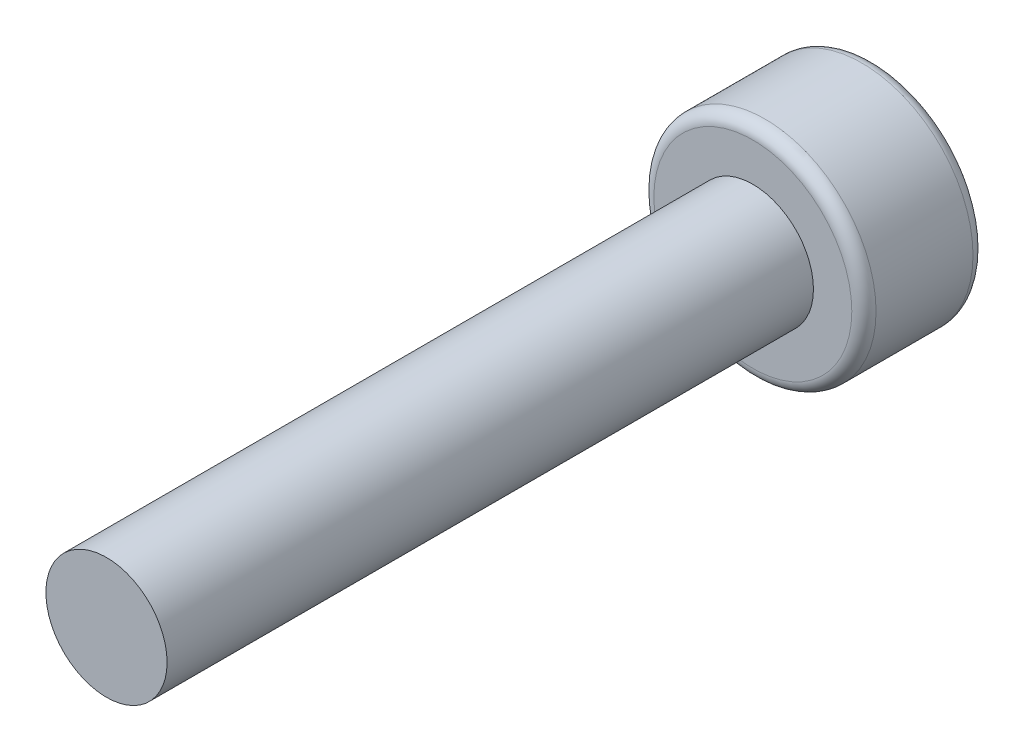
ISO-10303-21;
HEADER;
FILE_DESCRIPTION(('STEP AP214'),'2;1');
FILE_NAME('part.step','',(''),(''),'','','');
FILE_SCHEMA(('AUTOMOTIVE_DESIGN { 1 0 10303 214 1 1 1 1 }'));
ENDSEC;
DATA;
#1=APPLICATION_CONTEXT('core data for automotive mechanical design processes');
#2=APPLICATION_PROTOCOL_DEFINITION('international standard','automotive_design',2000,#1);
#3=PRODUCT_CONTEXT('',#1,'mechanical');
#4=PRODUCT('Part','Part','',(#3));
#5=PRODUCT_RELATED_PRODUCT_CATEGORY('part','',(#4));
#6=PRODUCT_DEFINITION_FORMATION('','',#4);
#7=PRODUCT_DEFINITION_CONTEXT('part definition',#1,'design');
#8=PRODUCT_DEFINITION('design','',#6,#7);
#9=PRODUCT_DEFINITION_SHAPE('','',#8);
#10=(LENGTH_UNIT() NAMED_UNIT(*) SI_UNIT(.MILLI.,.METRE.));
#11=(NAMED_UNIT(*) PLANE_ANGLE_UNIT() SI_UNIT($,.RADIAN.));
#12=(NAMED_UNIT(*) SI_UNIT($,.STERADIAN.) SOLID_ANGLE_UNIT());
#13=UNCERTAINTY_MEASURE_WITH_UNIT(LENGTH_MEASURE(1.E-05),#10,'distance_accuracy_value','');
#14=(GEOMETRIC_REPRESENTATION_CONTEXT(3) GLOBAL_UNCERTAINTY_ASSIGNED_CONTEXT((#13)) GLOBAL_UNIT_ASSIGNED_CONTEXT((#10,
#11,#12)) REPRESENTATION_CONTEXT('',''));
#15=CARTESIAN_POINT('',(0.,0.,0.));
#16=DIRECTION('',(0.,0.,1.));
#17=DIRECTION('',(1.,0.,0.));
#18=AXIS2_PLACEMENT_3D('',#15,#16,#17);
#19=CARTESIAN_POINT('',(0.,0.,3.));
#20=DIRECTION('',(0.,0.,-1.));
#21=DIRECTION('',(-1.,0.,0.));
#22=AXIS2_PLACEMENT_3D('',#19,#20,#21);
#23=CYLINDRICAL_SURFACE('',#22,2.75);
#24=CARTESIAN_POINT('',(0.,0.,0.3));
#25=DIRECTION('',(0.,0.,1.));
#26=DIRECTION('',(1.,0.,0.));
#27=AXIS2_PLACEMENT_3D('',#24,#25,#26);
#28=CIRCLE('',#27,2.75);
#29=CARTESIAN_POINT('',(2.75,0.,0.3));
#30=VERTEX_POINT('',#29);
#31=EDGE_CURVE('E155',#30,#30,#28,.T.);
#32=ORIENTED_EDGE('',*,*,#31,.T.);
#33=EDGE_LOOP('',(#32));
#34=FACE_BOUND('',#33,.T.);
#35=CARTESIAN_POINT('',(0.,0.,2.7));
#36=DIRECTION('',(0.,0.,1.));
#37=DIRECTION('',(1.,0.,0.));
#38=AXIS2_PLACEMENT_3D('',#35,#36,#37);
#39=CIRCLE('',#38,2.75);
#40=CARTESIAN_POINT('',(2.75,0.,2.7));
#41=VERTEX_POINT('',#40);
#42=EDGE_CURVE('E152',#41,#41,#39,.F.);
#43=ORIENTED_EDGE('',*,*,#42,.T.);
#44=EDGE_LOOP('',(#43));
#45=FACE_BOUND('',#44,.T.);
#46=ADVANCED_FACE('F39',(#34,#45),#23,.T.);
#47=CARTESIAN_POINT('',(0.,0.,3.));
#48=DIRECTION('',(0.,0.,1.));
#49=DIRECTION('',(1.,0.,0.));
#50=AXIS2_PLACEMENT_3D('',#47,#48,#49);
#51=PLANE('',#50);
#52=CARTESIAN_POINT('',(0.,0.,3.));
#53=DIRECTION('',(0.,0.,1.));
#54=DIRECTION('',(1.,0.,0.));
#55=AXIS2_PLACEMENT_3D('',#52,#53,#54);
#56=CIRCLE('',#55,2.45);
#57=CARTESIAN_POINT('',(2.45,0.,3.));
#58=VERTEX_POINT('',#57);
#59=EDGE_CURVE('E11',#58,#58,#56,.T.);
#60=ORIENTED_EDGE('',*,*,#59,.T.);
#61=EDGE_LOOP('',(#60));
#62=FACE_BOUND('',#61,.T.);
#63=CARTESIAN_POINT('',(0.,0.,3.));
#64=DIRECTION('',(0.,0.,1.));
#65=DIRECTION('',(1.,0.,0.));
#66=AXIS2_PLACEMENT_3D('',#63,#64,#65);
#67=CIRCLE('',#66,1.5);
#68=CARTESIAN_POINT('',(1.5,0.,3.));
#69=VERTEX_POINT('',#68);
#70=EDGE_CURVE('E149',#69,#69,#67,.T.);
#71=ORIENTED_EDGE('',*,*,#70,.F.);
#72=EDGE_LOOP('',(#71));
#73=FACE_BOUND('',#72,.T.);
#74=ADVANCED_FACE('F170',(#62,#73),#51,.T.);
#75=CARTESIAN_POINT('',(0.,0.,0.));
#76=DIRECTION('',(0.,0.,1.));
#77=DIRECTION('',(1.,0.,0.));
#78=AXIS2_PLACEMENT_3D('',#75,#76,#77);
#79=PLANE('',#78);
#80=DIRECTION('',(0.590811113127551,-0.806809908593706,0.));
#81=VECTOR('',#80,1.);
#82=CARTESIAN_POINT('',(0.820853493075304,1.8624081611757,0.));
#83=LINE('',#82,#81);
#84=CARTESIAN_POINT('',(0.820853493075304,1.8624081611757,0.));
#85=VERTEX_POINT('',#84);
#86=CARTESIAN_POINT('',(2.02331952633127,0.220324102799441,0.));
#87=VERTEX_POINT('',#86);
#88=EDGE_CURVE('E128',#85,#87,#83,.T.);
#89=ORIENTED_EDGE('',*,*,#88,.F.);
#90=DIRECTION('',(0.994123433430926,0.108252478509768,0.));
#91=VECTOR('',#90,1.);
#92=CARTESIAN_POINT('',(-1.20246603325596,1.64208405837626,0.));
#93=LINE('',#92,#91);
#94=CARTESIAN_POINT('',(-1.20246603325596,1.64208405837626,0.));
#95=VERTEX_POINT('',#94);
#96=EDGE_CURVE('E54',#95,#85,#93,.T.);
#97=ORIENTED_EDGE('',*,*,#96,.F.);
#98=DIRECTION('',(0.403312320303375,0.915062387103474,0.));
#99=VECTOR('',#98,1.);
#100=CARTESIAN_POINT('',(-2.02331952633127,-0.220324102799442,0.));
#101=LINE('',#100,#99);
#102=CARTESIAN_POINT('',(-2.02331952633127,-0.220324102799442,0.));
#103=VERTEX_POINT('',#102);
#104=EDGE_CURVE('E137',#103,#95,#101,.T.);
#105=ORIENTED_EDGE('',*,*,#104,.F.);
#106=DIRECTION('',(-0.590811113127551,0.806809908593706,0.));
#107=VECTOR('',#106,1.);
#108=CARTESIAN_POINT('',(-0.820853493075303,-1.8624081611757,0.));
#109=LINE('',#108,#107);
#110=CARTESIAN_POINT('',(-0.820853493075303,-1.8624081611757,0.));
#111=VERTEX_POINT('',#110);
#112=EDGE_CURVE('E135',#111,#103,#109,.T.);
#113=ORIENTED_EDGE('',*,*,#112,.F.);
#114=DIRECTION('',(-0.994123433430926,-0.108252478509768,0.));
#115=VECTOR('',#114,1.);
#116=CARTESIAN_POINT('',(1.20246603325596,-1.64208405837625,0.));
#117=LINE('',#116,#115);
#118=CARTESIAN_POINT('',(1.20246603325596,-1.64208405837625,0.));
#119=VERTEX_POINT('',#118);
#120=EDGE_CURVE('E102',#119,#111,#117,.T.);
#121=ORIENTED_EDGE('',*,*,#120,.F.);
#122=DIRECTION('',(-0.403312320303375,-0.915062387103474,0.));
#123=VECTOR('',#122,1.);
#124=CARTESIAN_POINT('',(2.02331952633127,0.220324102799441,0.));
#125=LINE('',#124,#123);
#126=EDGE_CURVE('E131',#87,#119,#125,.T.);
#127=ORIENTED_EDGE('',*,*,#126,.F.);
#128=EDGE_LOOP('',(#89,#97,#105,#113,#121,#127));
#129=FACE_BOUND('',#128,.T.);
#130=CARTESIAN_POINT('',(0.,0.,0.));
#131=DIRECTION('',(0.,0.,1.));
#132=DIRECTION('',(1.,0.,0.));
#133=AXIS2_PLACEMENT_3D('',#130,#131,#132);
#134=CIRCLE('',#133,2.45);
#135=CARTESIAN_POINT('',(2.45,0.,0.));
#136=VERTEX_POINT('',#135);
#137=EDGE_CURVE('E47',#136,#136,#134,.F.);
#138=ORIENTED_EDGE('',*,*,#137,.T.);
#139=EDGE_LOOP('',(#138));
#140=FACE_BOUND('',#139,.T.);
#141=ADVANCED_FACE('F160',(#129,#140),#79,.F.);
#142=CARTESIAN_POINT('',(0.,0.,19.));
#143=DIRECTION('',(0.,0.,-1.));
#144=DIRECTION('',(-1.,0.,0.));
#145=AXIS2_PLACEMENT_3D('',#142,#143,#144);
#146=CYLINDRICAL_SURFACE('',#145,1.5);
#147=CARTESIAN_POINT('',(0.,0.,19.));
#148=DIRECTION('',(0.,0.,1.));
#149=DIRECTION('',(1.,0.,0.));
#150=AXIS2_PLACEMENT_3D('',#147,#148,#149);
#151=CIRCLE('',#150,1.5);
#152=CARTESIAN_POINT('',(1.5,0.,19.));
#153=VERTEX_POINT('',#152);
#154=EDGE_CURVE('E141',#153,#153,#151,.T.);
#155=ORIENTED_EDGE('',*,*,#154,.F.);
#156=EDGE_LOOP('',(#155));
#157=FACE_BOUND('',#156,.T.);
#158=ORIENTED_EDGE('',*,*,#70,.T.);
#159=EDGE_LOOP('',(#158));
#160=FACE_BOUND('',#159,.T.);
#161=ADVANCED_FACE('F184',(#157,#160),#146,.T.);
#162=CARTESIAN_POINT('',(0.,0.,19.));
#163=DIRECTION('',(0.,0.,1.));
#164=DIRECTION('',(1.,0.,0.));
#165=AXIS2_PLACEMENT_3D('',#162,#163,#164);
#166=PLANE('',#165);
#167=ORIENTED_EDGE('',*,*,#154,.T.);
#168=EDGE_LOOP('',(#167));
#169=FACE_BOUND('',#168,.T.);
#170=ADVANCED_FACE('F165',(#169),#166,.T.);
#171=CARTESIAN_POINT('',(0.,0.,0.3));
#172=DIRECTION('',(0.,0.,1.));
#173=DIRECTION('',(1.,0.,0.));
#174=AXIS2_PLACEMENT_3D('',#171,#172,#173);
#175=TOROIDAL_SURFACE('',#174,2.45,0.3);
#176=ORIENTED_EDGE('',*,*,#137,.F.);
#177=EDGE_LOOP('',(#176));
#178=FACE_BOUND('',#177,.T.);
#179=ORIENTED_EDGE('',*,*,#31,.F.);
#180=EDGE_LOOP('',(#179));
#181=FACE_BOUND('',#180,.T.);
#182=ADVANCED_FACE('F162',(#178,#181),#175,.T.);
#183=CARTESIAN_POINT('',(0.,0.,2.7));
#184=DIRECTION('',(0.,0.,1.));
#185=DIRECTION('',(1.,0.,0.));
#186=AXIS2_PLACEMENT_3D('',#183,#184,#185);
#187=TOROIDAL_SURFACE('',#186,2.45,0.3);
#188=ORIENTED_EDGE('',*,*,#42,.F.);
#189=EDGE_LOOP('',(#188));
#190=FACE_BOUND('',#189,.T.);
#191=ORIENTED_EDGE('',*,*,#59,.F.);
#192=EDGE_LOOP('',(#191));
#193=FACE_BOUND('',#192,.T.);
#194=ADVANCED_FACE('F41',(#190,#193),#187,.T.);
#195=CARTESIAN_POINT('',(-1.20246603325596,1.64208405837626,2.));
#196=DIRECTION('',(-0.108252478509768,0.994123433430926,0.));
#197=DIRECTION('',(-0.994123433430926,-0.108252478509768,0.));
#198=AXIS2_PLACEMENT_3D('',#195,#196,#197);
#199=PLANE('',#198);
#200=ORIENTED_EDGE('',*,*,#96,.T.);
#201=DIRECTION('',(0.,0.,-1.));
#202=VECTOR('',#201,1.);
#203=CARTESIAN_POINT('',(0.820853493075304,1.8624081611757,2.));
#204=LINE('',#203,#202);
#205=CARTESIAN_POINT('',(0.820853493075304,1.8624081611757,2.));
#206=VERTEX_POINT('',#205);
#207=EDGE_CURVE('E84',#206,#85,#204,.T.);
#208=ORIENTED_EDGE('',*,*,#207,.F.);
#209=DIRECTION('',(0.994123433430926,0.108252478509768,0.));
#210=VECTOR('',#209,1.);
#211=CARTESIAN_POINT('',(-1.20246603325596,1.64208405837626,2.));
#212=LINE('',#211,#210);
#213=CARTESIAN_POINT('',(-1.20246603325596,1.64208405837626,2.));
#214=VERTEX_POINT('',#213);
#215=EDGE_CURVE('E139',#214,#206,#212,.T.);
#216=ORIENTED_EDGE('',*,*,#215,.F.);
#217=DIRECTION('',(0.,0.,-1.));
#218=VECTOR('',#217,1.);
#219=CARTESIAN_POINT('',(-1.20246603325596,1.64208405837626,2.));
#220=LINE('',#219,#218);
#221=EDGE_CURVE('E62',#214,#95,#220,.T.);
#222=ORIENTED_EDGE('',*,*,#221,.T.);
#223=EDGE_LOOP('',(#200,#208,#216,#222));
#224=FACE_BOUND('',#223,.T.);
#225=ADVANCED_FACE('F176',(#224),#199,.F.);
#226=CARTESIAN_POINT('',(-2.02331952633127,-0.220324102799442,2.));
#227=DIRECTION('',(-0.915062387103474,0.403312320303375,0.));
#228=DIRECTION('',(-0.403312320303375,-0.915062387103474,0.));
#229=AXIS2_PLACEMENT_3D('',#226,#227,#228);
#230=PLANE('',#229);
#231=ORIENTED_EDGE('',*,*,#104,.T.);
#232=ORIENTED_EDGE('',*,*,#221,.F.);
#233=DIRECTION('',(0.403312320303375,0.915062387103474,0.));
#234=VECTOR('',#233,1.);
#235=CARTESIAN_POINT('',(-2.02331952633127,-0.220324102799442,2.));
#236=LINE('',#235,#234);
#237=CARTESIAN_POINT('',(-2.02331952633127,-0.220324102799442,2.));
#238=VERTEX_POINT('',#237);
#239=EDGE_CURVE('E114',#238,#214,#236,.T.);
#240=ORIENTED_EDGE('',*,*,#239,.F.);
#241=DIRECTION('',(0.,0.,-1.));
#242=VECTOR('',#241,1.);
#243=CARTESIAN_POINT('',(-2.02331952633127,-0.220324102799442,2.));
#244=LINE('',#243,#242);
#245=EDGE_CURVE('E106',#238,#103,#244,.T.);
#246=ORIENTED_EDGE('',*,*,#245,.T.);
#247=EDGE_LOOP('',(#231,#232,#240,#246));
#248=FACE_BOUND('',#247,.T.);
#249=ADVANCED_FACE('F200',(#248),#230,.F.);
#250=CARTESIAN_POINT('',(-0.820853493075303,-1.8624081611757,2.));
#251=DIRECTION('',(-0.806809908593706,-0.590811113127551,0.));
#252=DIRECTION('',(0.590811113127551,-0.806809908593706,0.));
#253=AXIS2_PLACEMENT_3D('',#250,#251,#252);
#254=PLANE('',#253);
#255=ORIENTED_EDGE('',*,*,#112,.T.);
#256=ORIENTED_EDGE('',*,*,#245,.F.);
#257=DIRECTION('',(-0.590811113127551,0.806809908593706,0.));
#258=VECTOR('',#257,1.);
#259=CARTESIAN_POINT('',(-0.820853493075303,-1.8624081611757,2.));
#260=LINE('',#259,#258);
#261=CARTESIAN_POINT('',(-0.820853493075303,-1.8624081611757,2.));
#262=VERTEX_POINT('',#261);
#263=EDGE_CURVE('E110',#262,#238,#260,.T.);
#264=ORIENTED_EDGE('',*,*,#263,.F.);
#265=DIRECTION('',(0.,0.,-1.));
#266=VECTOR('',#265,1.);
#267=CARTESIAN_POINT('',(-0.820853493075303,-1.8624081611757,2.));
#268=LINE('',#267,#266);
#269=EDGE_CURVE('E95',#262,#111,#268,.T.);
#270=ORIENTED_EDGE('',*,*,#269,.T.);
#271=EDGE_LOOP('',(#255,#256,#264,#270));
#272=FACE_BOUND('',#271,.T.);
#273=ADVANCED_FACE('F111',(#272),#254,.F.);
#274=CARTESIAN_POINT('',(1.20246603325596,-1.64208405837625,2.));
#275=DIRECTION('',(0.108252478509768,-0.994123433430926,0.));
#276=DIRECTION('',(0.994123433430926,0.108252478509768,0.));
#277=AXIS2_PLACEMENT_3D('',#274,#275,#276);
#278=PLANE('',#277);
#279=ORIENTED_EDGE('',*,*,#120,.T.);
#280=ORIENTED_EDGE('',*,*,#269,.F.);
#281=DIRECTION('',(-0.994123433430926,-0.108252478509768,0.));
#282=VECTOR('',#281,1.);
#283=CARTESIAN_POINT('',(1.20246603325596,-1.64208405837625,2.));
#284=LINE('',#283,#282);
#285=CARTESIAN_POINT('',(1.20246603325596,-1.64208405837625,2.));
#286=VERTEX_POINT('',#285);
#287=EDGE_CURVE('E99',#286,#262,#284,.T.);
#288=ORIENTED_EDGE('',*,*,#287,.F.);
#289=DIRECTION('',(0.,0.,-1.));
#290=VECTOR('',#289,1.);
#291=CARTESIAN_POINT('',(1.20246603325596,-1.64208405837625,2.));
#292=LINE('',#291,#290);
#293=EDGE_CURVE('E107',#286,#119,#292,.T.);
#294=ORIENTED_EDGE('',*,*,#293,.T.);
#295=EDGE_LOOP('',(#279,#280,#288,#294));
#296=FACE_BOUND('',#295,.T.);
#297=ADVANCED_FACE('F97',(#296),#278,.F.);
#298=CARTESIAN_POINT('',(2.02331952633127,0.220324102799441,2.));
#299=DIRECTION('',(0.915062387103474,-0.403312320303375,0.));
#300=DIRECTION('',(0.403312320303375,0.915062387103474,0.));
#301=AXIS2_PLACEMENT_3D('',#298,#299,#300);
#302=PLANE('',#301);
#303=ORIENTED_EDGE('',*,*,#126,.T.);
#304=ORIENTED_EDGE('',*,*,#293,.F.);
#305=DIRECTION('',(-0.403312320303375,-0.915062387103474,0.));
#306=VECTOR('',#305,1.);
#307=CARTESIAN_POINT('',(2.02331952633127,0.220324102799441,2.));
#308=LINE('',#307,#306);
#309=CARTESIAN_POINT('',(2.02331952633127,0.220324102799441,2.));
#310=VERTEX_POINT('',#309);
#311=EDGE_CURVE('E120',#310,#286,#308,.T.);
#312=ORIENTED_EDGE('',*,*,#311,.F.);
#313=DIRECTION('',(0.,0.,-1.));
#314=VECTOR('',#313,1.);
#315=CARTESIAN_POINT('',(2.02331952633127,0.220324102799441,2.));
#316=LINE('',#315,#314);
#317=EDGE_CURVE('E144',#310,#87,#316,.T.);
#318=ORIENTED_EDGE('',*,*,#317,.T.);
#319=EDGE_LOOP('',(#303,#304,#312,#318));
#320=FACE_BOUND('',#319,.T.);
#321=ADVANCED_FACE('F204',(#320),#302,.F.);
#322=CARTESIAN_POINT('',(0.820853493075304,1.8624081611757,2.));
#323=DIRECTION('',(0.806809908593706,0.590811113127551,0.));
#324=DIRECTION('',(-0.590811113127551,0.806809908593706,0.));
#325=AXIS2_PLACEMENT_3D('',#322,#323,#324);
#326=PLANE('',#325);
#327=ORIENTED_EDGE('',*,*,#88,.T.);
#328=ORIENTED_EDGE('',*,*,#317,.F.);
#329=DIRECTION('',(0.590811113127551,-0.806809908593706,0.));
#330=VECTOR('',#329,1.);
#331=CARTESIAN_POINT('',(0.820853493075304,1.8624081611757,2.));
#332=LINE('',#331,#330);
#333=EDGE_CURVE('E122',#206,#310,#332,.T.);
#334=ORIENTED_EDGE('',*,*,#333,.F.);
#335=ORIENTED_EDGE('',*,*,#207,.T.);
#336=EDGE_LOOP('',(#327,#328,#334,#335));
#337=FACE_BOUND('',#336,.T.);
#338=ADVANCED_FACE('F201',(#337),#326,.F.);
#339=CARTESIAN_POINT('',(0.,0.,2.));
#340=DIRECTION('',(0.,0.,-1.));
#341=DIRECTION('',(-1.,0.,0.));
#342=AXIS2_PLACEMENT_3D('',#339,#340,#341);
#343=PLANE('',#342);
#344=ORIENTED_EDGE('',*,*,#215,.T.);
#345=ORIENTED_EDGE('',*,*,#333,.T.);
#346=ORIENTED_EDGE('',*,*,#311,.T.);
#347=ORIENTED_EDGE('',*,*,#287,.T.);
#348=ORIENTED_EDGE('',*,*,#263,.T.);
#349=ORIENTED_EDGE('',*,*,#239,.T.);
#350=EDGE_LOOP('',(#344,#345,#346,#347,#348,#349));
#351=FACE_BOUND('',#350,.T.);
#352=ADVANCED_FACE('F117',(#351),#343,.T.);
#353=CLOSED_SHELL('',(#46,#74,#141,#161,#170,#182,#194,#225,#249,#273,#297,#321,#338,#352));
#354=MANIFOLD_SOLID_BREP('B2',#353);
#355=ADVANCED_BREP_SHAPE_REPRESENTATION('',(#18,#354),#14);
#356=SHAPE_DEFINITION_REPRESENTATION(#9,#355);
ENDSEC;
END-ISO-10303-21;
